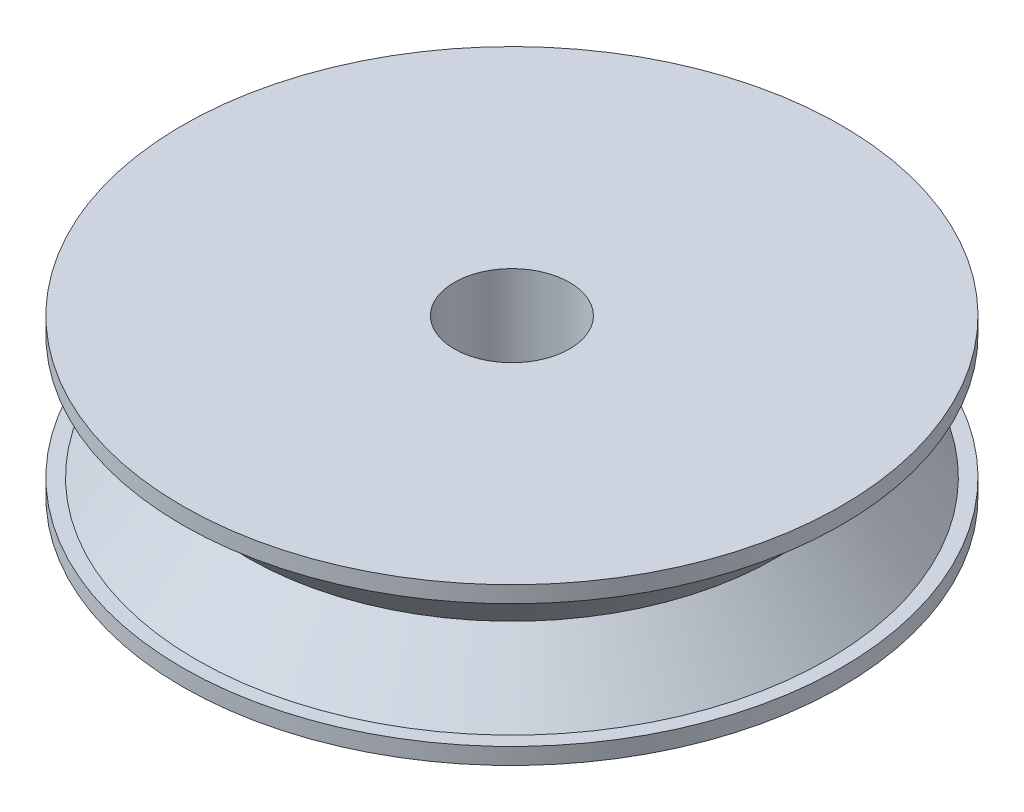
ISO-10303-21;
HEADER;
FILE_DESCRIPTION(('STEP AP214'),'2;1');
FILE_NAME('part.step','',(''),(''),'','','');
FILE_SCHEMA(('AUTOMOTIVE_DESIGN { 1 0 10303 214 1 1 1 1 }'));
ENDSEC;
DATA;
#1=APPLICATION_CONTEXT('core data for automotive mechanical design processes');
#2=APPLICATION_PROTOCOL_DEFINITION('international standard','automotive_design',2000,#1);
#3=PRODUCT_CONTEXT('',#1,'mechanical');
#4=PRODUCT('Part','Part','',(#3));
#5=PRODUCT_RELATED_PRODUCT_CATEGORY('part','',(#4));
#6=PRODUCT_DEFINITION_FORMATION('','',#4);
#7=PRODUCT_DEFINITION_CONTEXT('part definition',#1,'design');
#8=PRODUCT_DEFINITION('design','',#6,#7);
#9=PRODUCT_DEFINITION_SHAPE('','',#8);
#10=(LENGTH_UNIT() NAMED_UNIT(*) SI_UNIT(.MILLI.,.METRE.));
#11=(NAMED_UNIT(*) PLANE_ANGLE_UNIT() SI_UNIT($,.RADIAN.));
#12=(NAMED_UNIT(*) SI_UNIT($,.STERADIAN.) SOLID_ANGLE_UNIT());
#13=UNCERTAINTY_MEASURE_WITH_UNIT(LENGTH_MEASURE(1.E-05),#10,'distance_accuracy_value','');
#14=(GEOMETRIC_REPRESENTATION_CONTEXT(3) GLOBAL_UNCERTAINTY_ASSIGNED_CONTEXT((#13)) GLOBAL_UNIT_ASSIGNED_CONTEXT((#10,
#11,#12)) REPRESENTATION_CONTEXT('',''));
#15=CARTESIAN_POINT('',(0.,0.,0.));
#16=DIRECTION('',(0.,0.,1.));
#17=DIRECTION('',(1.,0.,0.));
#18=AXIS2_PLACEMENT_3D('',#15,#16,#17);
#19=CARTESIAN_POINT('',(0.,4.75,0.));
#20=DIRECTION('',(0.,-1.,0.));
#21=DIRECTION('',(0.,0.,-1.));
#22=AXIS2_PLACEMENT_3D('',#19,#20,#21);
#23=CYLINDRICAL_SURFACE('',#22,10.);
#24=CARTESIAN_POINT('',(0.,4.75,0.));
#25=DIRECTION('',(0.,1.,0.));
#26=DIRECTION('',(0.,0.,1.));
#27=AXIS2_PLACEMENT_3D('',#24,#25,#26);
#28=CIRCLE('',#27,10.);
#29=CARTESIAN_POINT('',(0.,4.75,10.));
#30=VERTEX_POINT('',#29);
#31=EDGE_CURVE('E10',#30,#30,#28,.T.);
#32=ORIENTED_EDGE('',*,*,#31,.F.);
#33=EDGE_LOOP('',(#32));
#34=FACE_BOUND('',#33,.T.);
#35=CARTESIAN_POINT('',(0.,4.25,0.));
#36=DIRECTION('',(0.,1.,0.));
#37=DIRECTION('',(0.,0.,1.));
#38=AXIS2_PLACEMENT_3D('',#35,#36,#37);
#39=CIRCLE('',#38,10.);
#40=CARTESIAN_POINT('',(0.,4.25,10.));
#41=VERTEX_POINT('',#40);
#42=EDGE_CURVE('E48',#41,#41,#39,.T.);
#43=ORIENTED_EDGE('',*,*,#42,.T.);
#44=EDGE_LOOP('',(#43));
#45=FACE_BOUND('',#44,.T.);
#46=ADVANCED_FACE('F31',(#34,#45),#23,.T.);
#47=CARTESIAN_POINT('',(0.,4.75,0.));
#48=DIRECTION('',(0.,1.,0.));
#49=DIRECTION('',(0.,0.,1.));
#50=AXIS2_PLACEMENT_3D('',#47,#48,#49);
#51=PLANE('',#50);
#52=CARTESIAN_POINT('',(0.,4.75,0.));
#53=DIRECTION('',(0.,1.,0.));
#54=DIRECTION('',(0.,0.,1.));
#55=AXIS2_PLACEMENT_3D('',#52,#53,#54);
#56=CIRCLE('',#55,1.75);
#57=CARTESIAN_POINT('',(0.,4.75,1.75));
#58=VERTEX_POINT('',#57);
#59=EDGE_CURVE('E58',#58,#58,#56,.T.);
#60=ORIENTED_EDGE('',*,*,#59,.F.);
#61=EDGE_LOOP('',(#60));
#62=FACE_BOUND('',#61,.T.);
#63=ORIENTED_EDGE('',*,*,#31,.T.);
#64=EDGE_LOOP('',(#63));
#65=FACE_BOUND('',#64,.T.);
#66=ADVANCED_FACE('F74',(#62,#65),#51,.T.);
#67=CARTESIAN_POINT('',(0.,2.375,0.));
#68=DIRECTION('',(0.,-1.,0.));
#69=DIRECTION('',(0.,0.,-1.));
#70=AXIS2_PLACEMENT_3D('',#67,#68,#69);
#71=CONICAL_SURFACE('',#70,8.,0.699892869719244);
#72=CARTESIAN_POINT('',(0.,0.5,0.));
#73=DIRECTION('',(0.,1.,0.));
#74=DIRECTION('',(0.,0.,1.));
#75=AXIS2_PLACEMENT_3D('',#72,#73,#74);
#76=CIRCLE('',#75,9.57894736842105);
#77=CARTESIAN_POINT('',(0.,0.5,9.57894736842105));
#78=VERTEX_POINT('',#77);
#79=EDGE_CURVE('E54',#78,#78,#76,.T.);
#80=ORIENTED_EDGE('',*,*,#79,.T.);
#81=EDGE_LOOP('',(#80));
#82=FACE_BOUND('',#81,.T.);
#83=CARTESIAN_POINT('',(0.,2.375,0.));
#84=DIRECTION('',(0.,1.,0.));
#85=DIRECTION('',(0.,0.,1.));
#86=AXIS2_PLACEMENT_3D('',#83,#84,#85);
#87=CIRCLE('',#86,8.);
#88=CARTESIAN_POINT('',(0.,2.375,8.));
#89=VERTEX_POINT('',#88);
#90=EDGE_CURVE('E41',#89,#89,#87,.T.);
#91=ORIENTED_EDGE('',*,*,#90,.F.);
#92=EDGE_LOOP('',(#91));
#93=FACE_BOUND('',#92,.T.);
#94=ADVANCED_FACE('F76',(#82,#93),#71,.T.);
#95=CARTESIAN_POINT('',(0.,4.25,0.));
#96=DIRECTION('',(0.,1.,0.));
#97=DIRECTION('',(0.,0.,1.));
#98=AXIS2_PLACEMENT_3D('',#95,#96,#97);
#99=CONICAL_SURFACE('',#98,9.57894736842105,0.699892869719244);
#100=ORIENTED_EDGE('',*,*,#90,.T.);
#101=EDGE_LOOP('',(#100));
#102=FACE_BOUND('',#101,.T.);
#103=CARTESIAN_POINT('',(0.,4.25,0.));
#104=DIRECTION('',(0.,1.,0.));
#105=DIRECTION('',(0.,0.,1.));
#106=AXIS2_PLACEMENT_3D('',#103,#104,#105);
#107=CIRCLE('',#106,9.57894736842105);
#108=CARTESIAN_POINT('',(0.,4.25,9.57894736842105));
#109=VERTEX_POINT('',#108);
#110=EDGE_CURVE('E45',#109,#109,#107,.T.);
#111=ORIENTED_EDGE('',*,*,#110,.F.);
#112=EDGE_LOOP('',(#111));
#113=FACE_BOUND('',#112,.T.);
#114=ADVANCED_FACE('F82',(#102,#113),#99,.T.);
#115=CARTESIAN_POINT('',(0.,4.25,-10.));
#116=DIRECTION('',(0.,-1.,0.));
#117=DIRECTION('',(0.,0.,-1.));
#118=AXIS2_PLACEMENT_3D('',#115,#116,#117);
#119=PLANE('',#118);
#120=ORIENTED_EDGE('',*,*,#110,.T.);
#121=EDGE_LOOP('',(#120));
#122=FACE_BOUND('',#121,.T.);
#123=ORIENTED_EDGE('',*,*,#42,.F.);
#124=EDGE_LOOP('',(#123));
#125=FACE_BOUND('',#124,.T.);
#126=ADVANCED_FACE('F94',(#122,#125),#119,.T.);
#127=CARTESIAN_POINT('',(0.,0.5,-10.));
#128=DIRECTION('',(0.,1.,0.));
#129=DIRECTION('',(0.,0.,1.));
#130=AXIS2_PLACEMENT_3D('',#127,#128,#129);
#131=PLANE('',#130);
#132=CARTESIAN_POINT('',(0.,0.5,0.));
#133=DIRECTION('',(0.,1.,0.));
#134=DIRECTION('',(0.,0.,1.));
#135=AXIS2_PLACEMENT_3D('',#132,#133,#134);
#136=CIRCLE('',#135,10.);
#137=CARTESIAN_POINT('',(0.,0.5,10.));
#138=VERTEX_POINT('',#137);
#139=EDGE_CURVE('E51',#138,#138,#136,.T.);
#140=ORIENTED_EDGE('',*,*,#139,.T.);
#141=EDGE_LOOP('',(#140));
#142=FACE_BOUND('',#141,.T.);
#143=ORIENTED_EDGE('',*,*,#79,.F.);
#144=EDGE_LOOP('',(#143));
#145=FACE_BOUND('',#144,.T.);
#146=ADVANCED_FACE('F88',(#142,#145),#131,.T.);
#147=CARTESIAN_POINT('',(0.,0.,0.));
#148=DIRECTION('',(0.,1.,0.));
#149=DIRECTION('',(0.,0.,1.));
#150=AXIS2_PLACEMENT_3D('',#147,#148,#149);
#151=PLANE('',#150);
#152=CARTESIAN_POINT('',(0.,0.,0.));
#153=DIRECTION('',(0.,1.,0.));
#154=DIRECTION('',(0.,0.,1.));
#155=AXIS2_PLACEMENT_3D('',#152,#153,#154);
#156=CIRCLE('',#155,1.75);
#157=CARTESIAN_POINT('',(0.,0.,1.75));
#158=VERTEX_POINT('',#157);
#159=EDGE_CURVE('E57',#158,#158,#156,.T.);
#160=ORIENTED_EDGE('',*,*,#159,.T.);
#161=EDGE_LOOP('',(#160));
#162=FACE_BOUND('',#161,.T.);
#163=CARTESIAN_POINT('',(0.,0.,0.));
#164=DIRECTION('',(0.,1.,0.));
#165=DIRECTION('',(0.,0.,1.));
#166=AXIS2_PLACEMENT_3D('',#163,#164,#165);
#167=CIRCLE('',#166,10.);
#168=CARTESIAN_POINT('',(0.,0.,10.));
#169=VERTEX_POINT('',#168);
#170=EDGE_CURVE('E34',#169,#169,#167,.T.);
#171=ORIENTED_EDGE('',*,*,#170,.F.);
#172=EDGE_LOOP('',(#171));
#173=FACE_BOUND('',#172,.T.);
#174=ADVANCED_FACE('F64',(#162,#173),#151,.F.);
#175=ORIENTED_EDGE('',*,*,#170,.T.);
#176=EDGE_LOOP('',(#175));
#177=FACE_BOUND('',#176,.T.);
#178=ORIENTED_EDGE('',*,*,#139,.F.);
#179=EDGE_LOOP('',(#178));
#180=FACE_BOUND('',#179,.T.);
#181=ADVANCED_FACE('F70',(#177,#180),#23,.T.);
#182=CARTESIAN_POINT('',(0.,0.,0.));
#183=DIRECTION('',(0.,1.,0.));
#184=DIRECTION('',(0.,0.,1.));
#185=AXIS2_PLACEMENT_3D('',#182,#183,#184);
#186=CYLINDRICAL_SURFACE('',#185,1.75);
#187=ORIENTED_EDGE('',*,*,#159,.F.);
#188=EDGE_LOOP('',(#187));
#189=FACE_BOUND('',#188,.T.);
#190=ORIENTED_EDGE('',*,*,#59,.T.);
#191=EDGE_LOOP('',(#190));
#192=FACE_BOUND('',#191,.T.);
#193=ADVANCED_FACE('F67',(#189,#192),#186,.F.);
#194=CLOSED_SHELL('',(#46,#66,#94,#114,#126,#146,#174,#181,#193));
#195=MANIFOLD_SOLID_BREP('B2',#194);
#196=ADVANCED_BREP_SHAPE_REPRESENTATION('',(#18,#195),#14);
#197=SHAPE_DEFINITION_REPRESENTATION(#9,#196);
ENDSEC;
END-ISO-10303-21;
